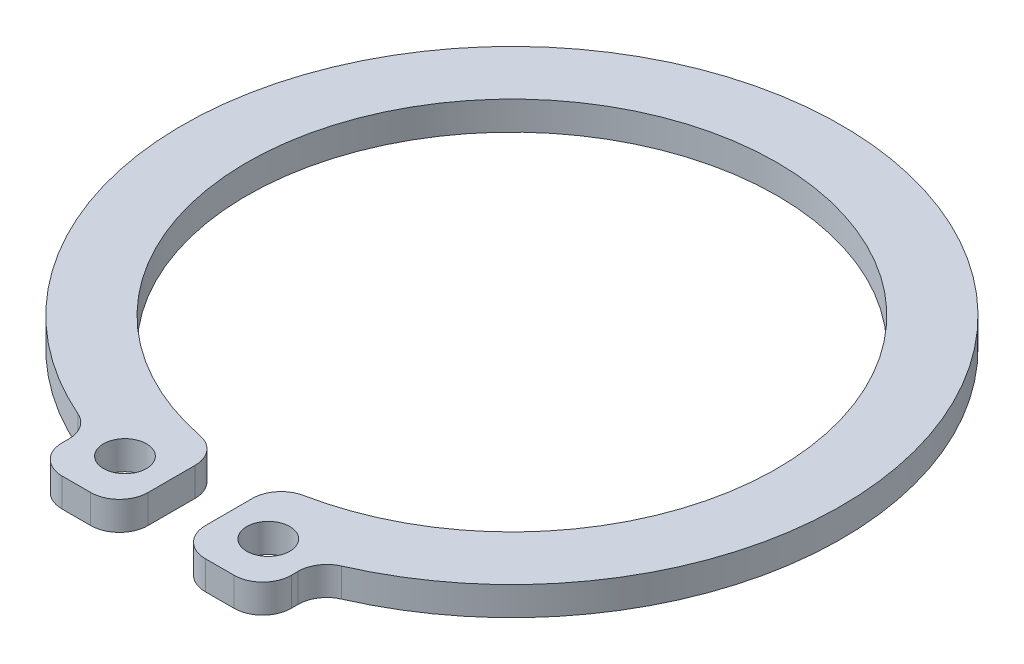
ISO-10303-21;
HEADER;
FILE_DESCRIPTION(('STEP AP214'),'2;1');
FILE_NAME('part.step','',(''),(''),'','','');
FILE_SCHEMA(('AUTOMOTIVE_DESIGN { 1 0 10303 214 1 1 1 1 }'));
ENDSEC;
DATA;
#1=APPLICATION_CONTEXT('core data for automotive mechanical design processes');
#2=APPLICATION_PROTOCOL_DEFINITION('international standard','automotive_design',2000,#1);
#3=PRODUCT_CONTEXT('',#1,'mechanical');
#4=PRODUCT('Part','Part','',(#3));
#5=PRODUCT_RELATED_PRODUCT_CATEGORY('part','',(#4));
#6=PRODUCT_DEFINITION_FORMATION('','',#4);
#7=PRODUCT_DEFINITION_CONTEXT('part definition',#1,'design');
#8=PRODUCT_DEFINITION('design','',#6,#7);
#9=PRODUCT_DEFINITION_SHAPE('','',#8);
#10=(LENGTH_UNIT() NAMED_UNIT(*) SI_UNIT(.MILLI.,.METRE.));
#11=(NAMED_UNIT(*) PLANE_ANGLE_UNIT() SI_UNIT($,.RADIAN.));
#12=(NAMED_UNIT(*) SI_UNIT($,.STERADIAN.) SOLID_ANGLE_UNIT());
#13=UNCERTAINTY_MEASURE_WITH_UNIT(LENGTH_MEASURE(1.E-05),#10,'distance_accuracy_value','');
#14=(GEOMETRIC_REPRESENTATION_CONTEXT(3) GLOBAL_UNCERTAINTY_ASSIGNED_CONTEXT((#13)) GLOBAL_UNIT_ASSIGNED_CONTEXT((#10,
#11,#12)) REPRESENTATION_CONTEXT('',''));
#15=CARTESIAN_POINT('',(0.,0.,0.));
#16=DIRECTION('',(0.,0.,1.));
#17=DIRECTION('',(1.,0.,0.));
#18=AXIS2_PLACEMENT_3D('',#15,#16,#17);
#19=CARTESIAN_POINT('',(0.,0.,0.));
#20=DIRECTION('',(0.,1.,0.));
#21=DIRECTION('',(1.,0.,0.));
#22=AXIS2_PLACEMENT_3D('',#19,#20,#21);
#23=PLANE('',#22);
#24=CARTESIAN_POINT('',(2.5,0.,11.));
#25=DIRECTION('',(0.,1.,0.));
#26=DIRECTION('',(0.,0.,1.));
#27=AXIS2_PLACEMENT_3D('',#24,#25,#26);
#28=CIRCLE('',#27,0.75);
#29=CARTESIAN_POINT('',(2.5,0.,11.75));
#30=VERTEX_POINT('',#29);
#31=EDGE_CURVE('E224',#30,#30,#28,.T.);
#32=ORIENTED_EDGE('',*,*,#31,.T.);
#33=EDGE_LOOP('',(#32));
#34=FACE_BOUND('',#33,.T.);
#35=CARTESIAN_POINT('',(-2.5,0.,11.));
#36=DIRECTION('',(0.,1.,0.));
#37=DIRECTION('',(0.,0.,1.));
#38=AXIS2_PLACEMENT_3D('',#35,#36,#37);
#39=CIRCLE('',#38,0.75);
#40=CARTESIAN_POINT('',(-2.5,0.,11.75));
#41=VERTEX_POINT('',#40);
#42=EDGE_CURVE('E756',#41,#41,#39,.T.);
#43=ORIENTED_EDGE('',*,*,#42,.T.);
#44=EDGE_LOOP('',(#43));
#45=FACE_BOUND('',#44,.T.);
#46=DIRECTION('',(0.,0.,-1.));
#47=VECTOR('',#46,1.);
#48=CARTESIAN_POINT('',(-1.,0.,0.));
#49=LINE('',#48,#47);
#50=CARTESIAN_POINT('',(-1.,0.,11.69578707887));
#51=VERTEX_POINT('',#50);
#52=CARTESIAN_POINT('',(-1.,0.,10.05298463144));
#53=VERTEX_POINT('',#52);
#54=EDGE_CURVE('E291',#51,#53,#49,.T.);
#55=ORIENTED_EDGE('',*,*,#54,.F.);
#56=CARTESIAN_POINT('',(-2.,0.,11.69578707887));
#57=DIRECTION('',(0.,1.,0.));
#58=DIRECTION('',(0.,0.,-1.));
#59=AXIS2_PLACEMENT_3D('',#56,#57,#58);
#60=CIRCLE('',#59,1.);
#61=CARTESIAN_POINT('',(-2.,0.,12.69578707887));
#62=VERTEX_POINT('',#61);
#63=EDGE_CURVE('E304',#62,#51,#60,.T.);
#64=ORIENTED_EDGE('',*,*,#63,.F.);
#65=DIRECTION('',(1.,0.,0.));
#66=VECTOR('',#65,1.);
#67=CARTESIAN_POINT('',(0.,0.,12.69578707887));
#68=LINE('',#67,#66);
#69=CARTESIAN_POINT('',(-3.,0.,12.69578707887));
#70=VERTEX_POINT('',#69);
#71=EDGE_CURVE('E314',#70,#62,#68,.T.);
#72=ORIENTED_EDGE('',*,*,#71,.F.);
#73=CARTESIAN_POINT('',(-3.,0.,11.69578707887));
#74=DIRECTION('',(0.,1.,0.));
#75=DIRECTION('',(0.,0.,-1.));
#76=AXIS2_PLACEMENT_3D('',#73,#74,#75);
#77=CIRCLE('',#76,1.);
#78=CARTESIAN_POINT('',(-4.,0.,11.69578707887));
#79=VERTEX_POINT('',#78);
#80=EDGE_CURVE('E246',#79,#70,#77,.T.);
#81=ORIENTED_EDGE('',*,*,#80,.F.);
#82=DIRECTION('',(0.,0.,1.));
#83=VECTOR('',#82,1.);
#84=CARTESIAN_POINT('',(-4.,0.,0.));
#85=LINE('',#84,#83);
#86=CARTESIAN_POINT('',(-4.,0.,11.45643923739));
#87=VERTEX_POINT('',#86);
#88=EDGE_CURVE('E211',#87,#79,#85,.T.);
#89=ORIENTED_EDGE('',*,*,#88,.F.);
#90=CARTESIAN_POINT('',(-5.,0.,11.45643923739));
#91=DIRECTION('',(0.,-1.,0.));
#92=DIRECTION('',(0.,0.,1.));
#93=AXIS2_PLACEMENT_3D('',#90,#91,#92);
#94=CIRCLE('',#93,1.);
#95=CARTESIAN_POINT('',(-4.5999999999999,0.,10.5399240983989));
#96=VERTEX_POINT('',#95);
#97=EDGE_CURVE('E213',#96,#87,#94,.T.);
#98=ORIENTED_EDGE('',*,*,#97,.F.);
#99=CARTESIAN_POINT('',(0.,0.,0.));
#100=DIRECTION('',(0.,1.,0.));
#101=DIRECTION('',(0.,0.,1.));
#102=AXIS2_PLACEMENT_3D('',#99,#100,#101);
#103=CIRCLE('',#102,11.5);
#104=CARTESIAN_POINT('',(4.59999999999982,0.,10.5399240983987));
#105=VERTEX_POINT('',#104);
#106=EDGE_CURVE('E328',#105,#96,#103,.T.);
#107=ORIENTED_EDGE('',*,*,#106,.F.);
#108=CARTESIAN_POINT('',(5.,0.,11.45643923739));
#109=DIRECTION('',(0.,1.,0.));
#110=DIRECTION('',(0.,0.,1.));
#111=AXIS2_PLACEMENT_3D('',#108,#109,#110);
#112=CIRCLE('',#111,1.);
#113=CARTESIAN_POINT('',(4.,0.,11.45643923739));
#114=VERTEX_POINT('',#113);
#115=EDGE_CURVE('E295',#105,#114,#112,.T.);
#116=ORIENTED_EDGE('',*,*,#115,.T.);
#117=DIRECTION('',(0.,0.,-1.));
#118=VECTOR('',#117,1.);
#119=CARTESIAN_POINT('',(4.,0.,12.69578707887));
#120=LINE('',#119,#118);
#121=CARTESIAN_POINT('',(4.,0.,11.69578707887));
#122=VERTEX_POINT('',#121);
#123=EDGE_CURVE('E310',#122,#114,#120,.T.);
#124=ORIENTED_EDGE('',*,*,#123,.F.);
#125=CARTESIAN_POINT('',(3.,0.,11.69578707887));
#126=DIRECTION('',(0.,1.,0.));
#127=DIRECTION('',(0.,0.,-1.));
#128=AXIS2_PLACEMENT_3D('',#125,#126,#127);
#129=CIRCLE('',#128,1.);
#130=CARTESIAN_POINT('',(3.,0.,12.69578707887));
#131=VERTEX_POINT('',#130);
#132=EDGE_CURVE('E346',#131,#122,#129,.T.);
#133=ORIENTED_EDGE('',*,*,#132,.F.);
#134=DIRECTION('',(1.,0.,0.));
#135=VECTOR('',#134,1.);
#136=CARTESIAN_POINT('',(1.,0.,12.69578707887));
#137=LINE('',#136,#135);
#138=CARTESIAN_POINT('',(2.,0.,12.69578707887));
#139=VERTEX_POINT('',#138);
#140=EDGE_CURVE('E181',#139,#131,#137,.T.);
#141=ORIENTED_EDGE('',*,*,#140,.F.);
#142=CARTESIAN_POINT('',(2.,0.,11.69578707887));
#143=DIRECTION('',(0.,1.,0.));
#144=DIRECTION('',(0.,0.,-1.));
#145=AXIS2_PLACEMENT_3D('',#142,#143,#144);
#146=CIRCLE('',#145,1.);
#147=CARTESIAN_POINT('',(1.,0.,11.69578707887));
#148=VERTEX_POINT('',#147);
#149=EDGE_CURVE('E180',#148,#139,#146,.T.);
#150=ORIENTED_EDGE('',*,*,#149,.F.);
#151=DIRECTION('',(0.,0.,1.));
#152=VECTOR('',#151,1.);
#153=CARTESIAN_POINT('',(1.,0.,9.195787078875));
#154=LINE('',#153,#152);
#155=CARTESIAN_POINT('',(1.,0.,10.05298463144));
#156=VERTEX_POINT('',#155);
#157=EDGE_CURVE('E176',#156,#148,#154,.T.);
#158=ORIENTED_EDGE('',*,*,#157,.F.);
#159=CARTESIAN_POINT('',(2.,0.,10.05298463144));
#160=DIRECTION('',(0.,1.,0.));
#161=DIRECTION('',(0.,0.,-1.));
#162=AXIS2_PLACEMENT_3D('',#159,#160,#161);
#163=CIRCLE('',#162,1.);
#164=CARTESIAN_POINT('',(1.8048780487803,0.,9.07220564300679));
#165=VERTEX_POINT('',#164);
#166=EDGE_CURVE('E20',#165,#156,#163,.T.);
#167=ORIENTED_EDGE('',*,*,#166,.F.);
#168=CARTESIAN_POINT('',(0.,0.,0.));
#169=DIRECTION('',(0.,1.,0.));
#170=DIRECTION('',(0.,0.,1.));
#171=AXIS2_PLACEMENT_3D('',#168,#169,#170);
#172=CIRCLE('',#171,9.25);
#173=CARTESIAN_POINT('',(-1.8048780487803,0.,9.07220564300679));
#174=VERTEX_POINT('',#173);
#175=EDGE_CURVE('E11',#165,#174,#172,.T.);
#176=ORIENTED_EDGE('',*,*,#175,.T.);
#177=CARTESIAN_POINT('',(-2.,0.,10.05298463144));
#178=DIRECTION('',(0.,1.,0.));
#179=DIRECTION('',(0.,0.,-1.));
#180=AXIS2_PLACEMENT_3D('',#177,#178,#179);
#181=CIRCLE('',#180,1.);
#182=EDGE_CURVE('E283',#53,#174,#181,.T.);
#183=ORIENTED_EDGE('',*,*,#182,.F.);
#184=EDGE_LOOP('',(#55,#64,#72,#81,#89,#98,#107,#116,#124,#133,#141,#150,#158,#167,#176,#183));
#185=FACE_BOUND('',#184,.T.);
#186=ADVANCED_FACE('F17',(#34,#45,#185),#23,.F.);
#187=CARTESIAN_POINT('',(0.,0.,0.));
#188=DIRECTION('',(0.,1.,0.));
#189=DIRECTION('',(0.,0.,1.));
#190=AXIS2_PLACEMENT_3D('',#187,#188,#189);
#191=CYLINDRICAL_SURFACE('',#190,9.25);
#192=ORIENTED_EDGE('',*,*,#175,.F.);
#193=DIRECTION('',(0.,-1.,0.));
#194=VECTOR('',#193,1.);
#195=CARTESIAN_POINT('',(1.80487804878011,2.3036,9.07220564300675));
#196=LINE('',#195,#194);
#197=CARTESIAN_POINT('',(1.8048780487803,1.,9.07220564300679));
#198=VERTEX_POINT('',#197);
#199=EDGE_CURVE('E355',#198,#165,#196,.T.);
#200=ORIENTED_EDGE('',*,*,#199,.F.);
#201=CARTESIAN_POINT('',(0.,1.,0.));
#202=DIRECTION('',(0.,-1.,0.));
#203=DIRECTION('',(0.,0.,1.));
#204=AXIS2_PLACEMENT_3D('',#201,#202,#203);
#205=CIRCLE('',#204,9.25);
#206=CARTESIAN_POINT('',(-1.8048780487803,1.,9.07220564300679));
#207=VERTEX_POINT('',#206);
#208=EDGE_CURVE('E206',#207,#198,#205,.T.);
#209=ORIENTED_EDGE('',*,*,#208,.F.);
#210=DIRECTION('',(0.,1.,0.));
#211=VECTOR('',#210,1.);
#212=CARTESIAN_POINT('',(-1.80487804878011,2.3036,9.07220564300675));
#213=LINE('',#212,#211);
#214=EDGE_CURVE('E274',#174,#207,#213,.T.);
#215=ORIENTED_EDGE('',*,*,#214,.F.);
#216=EDGE_LOOP('',(#192,#200,#209,#215));
#217=FACE_BOUND('',#216,.T.);
#218=ADVANCED_FACE('F397',(#217),#191,.F.);
#219=CARTESIAN_POINT('',(2.,2.3036,10.05298463144));
#220=DIRECTION('',(0.,-1.,0.));
#221=DIRECTION('',(0.,0.,-1.));
#222=AXIS2_PLACEMENT_3D('',#219,#220,#221);
#223=CYLINDRICAL_SURFACE('',#222,1.);
#224=DIRECTION('',(0.,-1.,0.));
#225=VECTOR('',#224,1.);
#226=CARTESIAN_POINT('',(1.,0.,10.05298463144));
#227=LINE('',#226,#225);
#228=CARTESIAN_POINT('',(1.,1.,10.05298463144));
#229=VERTEX_POINT('',#228);
#230=EDGE_CURVE('E333',#229,#156,#227,.T.);
#231=ORIENTED_EDGE('',*,*,#230,.F.);
#232=CARTESIAN_POINT('',(2.,1.,10.05298463144));
#233=DIRECTION('',(0.,1.,0.));
#234=DIRECTION('',(0.,0.,-1.));
#235=AXIS2_PLACEMENT_3D('',#232,#233,#234);
#236=CIRCLE('',#235,1.);
#237=EDGE_CURVE('E198',#198,#229,#236,.T.);
#238=ORIENTED_EDGE('',*,*,#237,.F.);
#239=ORIENTED_EDGE('',*,*,#199,.T.);
#240=ORIENTED_EDGE('',*,*,#166,.T.);
#241=EDGE_LOOP('',(#231,#238,#239,#240));
#242=FACE_BOUND('',#241,.T.);
#243=ADVANCED_FACE('F402',(#242),#223,.T.);
#244=CARTESIAN_POINT('',(1.,0.,9.195787078875));
#245=DIRECTION('',(-1.,0.,0.));
#246=DIRECTION('',(0.,0.,1.));
#247=AXIS2_PLACEMENT_3D('',#244,#245,#246);
#248=PLANE('',#247);
#249=ORIENTED_EDGE('',*,*,#157,.T.);
#250=DIRECTION('',(0.,-1.,0.));
#251=VECTOR('',#250,1.);
#252=CARTESIAN_POINT('',(1.,2.3036,11.69578707887));
#253=LINE('',#252,#251);
#254=CARTESIAN_POINT('',(1.,1.,11.69578707887));
#255=VERTEX_POINT('',#254);
#256=EDGE_CURVE('E169',#255,#148,#253,.T.);
#257=ORIENTED_EDGE('',*,*,#256,.F.);
#258=DIRECTION('',(0.,0.,1.));
#259=VECTOR('',#258,1.);
#260=CARTESIAN_POINT('',(1.,1.,0.));
#261=LINE('',#260,#259);
#262=EDGE_CURVE('E173',#229,#255,#261,.T.);
#263=ORIENTED_EDGE('',*,*,#262,.F.);
#264=ORIENTED_EDGE('',*,*,#230,.T.);
#265=EDGE_LOOP('',(#249,#257,#263,#264));
#266=FACE_BOUND('',#265,.T.);
#267=ADVANCED_FACE('F171',(#266),#248,.T.);
#268=CARTESIAN_POINT('',(2.,2.3036,11.69578707887));
#269=DIRECTION('',(0.,-1.,0.));
#270=DIRECTION('',(0.,0.,-1.));
#271=AXIS2_PLACEMENT_3D('',#268,#269,#270);
#272=CYLINDRICAL_SURFACE('',#271,1.);
#273=DIRECTION('',(0.,-1.,0.));
#274=VECTOR('',#273,1.);
#275=CARTESIAN_POINT('',(2.,0.,12.69578707887));
#276=LINE('',#275,#274);
#277=CARTESIAN_POINT('',(2.,1.,12.69578707887));
#278=VERTEX_POINT('',#277);
#279=EDGE_CURVE('E187',#278,#139,#276,.T.);
#280=ORIENTED_EDGE('',*,*,#279,.F.);
#281=CARTESIAN_POINT('',(2.,1.,11.69578707887));
#282=DIRECTION('',(0.,1.,0.));
#283=DIRECTION('',(0.,0.,-1.));
#284=AXIS2_PLACEMENT_3D('',#281,#282,#283);
#285=CIRCLE('',#284,1.);
#286=EDGE_CURVE('E184',#255,#278,#285,.T.);
#287=ORIENTED_EDGE('',*,*,#286,.F.);
#288=ORIENTED_EDGE('',*,*,#256,.T.);
#289=ORIENTED_EDGE('',*,*,#149,.T.);
#290=EDGE_LOOP('',(#280,#287,#288,#289));
#291=FACE_BOUND('',#290,.T.);
#292=ADVANCED_FACE('F185',(#291),#272,.T.);
#293=CARTESIAN_POINT('',(1.,0.,12.69578707887));
#294=DIRECTION('',(0.,0.,1.));
#295=DIRECTION('',(1.,0.,0.));
#296=AXIS2_PLACEMENT_3D('',#293,#294,#295);
#297=PLANE('',#296);
#298=DIRECTION('',(1.,0.,0.));
#299=VECTOR('',#298,1.);
#300=CARTESIAN_POINT('',(0.,1.,12.69578707887));
#301=LINE('',#300,#299);
#302=CARTESIAN_POINT('',(3.,1.,12.69578707887));
#303=VERTEX_POINT('',#302);
#304=EDGE_CURVE('E192',#278,#303,#301,.T.);
#305=ORIENTED_EDGE('',*,*,#304,.F.);
#306=ORIENTED_EDGE('',*,*,#279,.T.);
#307=ORIENTED_EDGE('',*,*,#140,.T.);
#308=DIRECTION('',(0.,-1.,0.));
#309=VECTOR('',#308,1.);
#310=CARTESIAN_POINT('',(3.,2.3036,12.69578707887));
#311=LINE('',#310,#309);
#312=EDGE_CURVE('E343',#303,#131,#311,.T.);
#313=ORIENTED_EDGE('',*,*,#312,.F.);
#314=EDGE_LOOP('',(#305,#306,#307,#313));
#315=FACE_BOUND('',#314,.T.);
#316=ADVANCED_FACE('F517',(#315),#297,.T.);
#317=CARTESIAN_POINT('',(3.,2.3036,11.69578707887));
#318=DIRECTION('',(0.,-1.,0.));
#319=DIRECTION('',(0.,0.,-1.));
#320=AXIS2_PLACEMENT_3D('',#317,#318,#319);
#321=CYLINDRICAL_SURFACE('',#320,1.);
#322=DIRECTION('',(0.,-1.,0.));
#323=VECTOR('',#322,1.);
#324=CARTESIAN_POINT('',(4.,0.,11.69578707887));
#325=LINE('',#324,#323);
#326=CARTESIAN_POINT('',(4.,1.,11.69578707887));
#327=VERTEX_POINT('',#326);
#328=EDGE_CURVE('E339',#327,#122,#325,.T.);
#329=ORIENTED_EDGE('',*,*,#328,.F.);
#330=CARTESIAN_POINT('',(3.,1.,11.69578707887));
#331=DIRECTION('',(0.,1.,0.));
#332=DIRECTION('',(0.,0.,-1.));
#333=AXIS2_PLACEMENT_3D('',#330,#331,#332);
#334=CIRCLE('',#333,1.);
#335=EDGE_CURVE('E223',#303,#327,#334,.T.);
#336=ORIENTED_EDGE('',*,*,#335,.F.);
#337=ORIENTED_EDGE('',*,*,#312,.T.);
#338=ORIENTED_EDGE('',*,*,#132,.T.);
#339=EDGE_LOOP('',(#329,#336,#337,#338));
#340=FACE_BOUND('',#339,.T.);
#341=ADVANCED_FACE('F374',(#340),#321,.T.);
#342=CARTESIAN_POINT('',(4.,0.,12.69578707887));
#343=DIRECTION('',(1.,0.,0.));
#344=DIRECTION('',(0.,1.,0.));
#345=AXIS2_PLACEMENT_3D('',#342,#343,#344);
#346=PLANE('',#345);
#347=ORIENTED_EDGE('',*,*,#123,.T.);
#348=DIRECTION('',(0.,1.,0.));
#349=VECTOR('',#348,1.);
#350=CARTESIAN_POINT('',(4.,-1.3036,11.45643923739));
#351=LINE('',#350,#349);
#352=CARTESIAN_POINT('',(4.,1.,11.45643923739));
#353=VERTEX_POINT('',#352);
#354=EDGE_CURVE('E299',#114,#353,#351,.T.);
#355=ORIENTED_EDGE('',*,*,#354,.T.);
#356=DIRECTION('',(0.,0.,-1.));
#357=VECTOR('',#356,1.);
#358=CARTESIAN_POINT('',(4.,1.,0.));
#359=LINE('',#358,#357);
#360=EDGE_CURVE('E218',#327,#353,#359,.T.);
#361=ORIENTED_EDGE('',*,*,#360,.F.);
#362=ORIENTED_EDGE('',*,*,#328,.T.);
#363=EDGE_LOOP('',(#347,#355,#361,#362));
#364=FACE_BOUND('',#363,.T.);
#365=ADVANCED_FACE('F368',(#364),#346,.T.);
#366=CARTESIAN_POINT('',(5.,-1.3036,11.45643923739));
#367=DIRECTION('',(0.,1.,0.));
#368=DIRECTION('',(0.,0.,1.));
#369=AXIS2_PLACEMENT_3D('',#366,#367,#368);
#370=CYLINDRICAL_SURFACE('',#369,1.);
#371=ORIENTED_EDGE('',*,*,#115,.F.);
#372=DIRECTION('',(0.,-1.,0.));
#373=VECTOR('',#372,1.);
#374=CARTESIAN_POINT('',(4.59999999999964,0.,10.5399240983986));
#375=LINE('',#374,#373);
#376=CARTESIAN_POINT('',(4.59999999999982,1.,10.5399240983987));
#377=VERTEX_POINT('',#376);
#378=EDGE_CURVE('E300',#377,#105,#375,.T.);
#379=ORIENTED_EDGE('',*,*,#378,.F.);
#380=CARTESIAN_POINT('',(5.,1.,11.45643923739));
#381=DIRECTION('',(0.,-1.,0.));
#382=DIRECTION('',(0.,0.,1.));
#383=AXIS2_PLACEMENT_3D('',#380,#381,#382);
#384=CIRCLE('',#383,1.);
#385=EDGE_CURVE('E222',#353,#377,#384,.T.);
#386=ORIENTED_EDGE('',*,*,#385,.F.);
#387=ORIENTED_EDGE('',*,*,#354,.F.);
#388=EDGE_LOOP('',(#371,#379,#386,#387));
#389=FACE_BOUND('',#388,.T.);
#390=ADVANCED_FACE('F373',(#389),#370,.F.);
#391=CARTESIAN_POINT('',(0.,0.,0.));
#392=DIRECTION('',(0.,1.,0.));
#393=DIRECTION('',(0.,0.,1.));
#394=AXIS2_PLACEMENT_3D('',#391,#392,#393);
#395=CYLINDRICAL_SURFACE('',#394,11.5);
#396=ORIENTED_EDGE('',*,*,#106,.T.);
#397=DIRECTION('',(0.,1.,0.));
#398=VECTOR('',#397,1.);
#399=CARTESIAN_POINT('',(-4.59999999999979,-1.3036,10.5399240983989));
#400=LINE('',#399,#398);
#401=CARTESIAN_POINT('',(-4.5999999999999,1.,10.5399240983989));
#402=VERTEX_POINT('',#401);
#403=EDGE_CURVE('E325',#96,#402,#400,.T.);
#404=ORIENTED_EDGE('',*,*,#403,.T.);
#405=CARTESIAN_POINT('',(0.,1.,0.));
#406=DIRECTION('',(0.,1.,0.));
#407=DIRECTION('',(0.,0.,1.));
#408=AXIS2_PLACEMENT_3D('',#405,#406,#407);
#409=CIRCLE('',#408,11.5);
#410=EDGE_CURVE('E250',#377,#402,#409,.T.);
#411=ORIENTED_EDGE('',*,*,#410,.F.);
#412=ORIENTED_EDGE('',*,*,#378,.T.);
#413=EDGE_LOOP('',(#396,#404,#411,#412));
#414=FACE_BOUND('',#413,.T.);
#415=ADVANCED_FACE('F416',(#414),#395,.T.);
#416=CARTESIAN_POINT('',(-5.,-1.3036,11.45643923739));
#417=DIRECTION('',(0.,1.,0.));
#418=DIRECTION('',(0.,0.,1.));
#419=AXIS2_PLACEMENT_3D('',#416,#417,#418);
#420=CYLINDRICAL_SURFACE('',#419,1.);
#421=ORIENTED_EDGE('',*,*,#97,.T.);
#422=DIRECTION('',(0.,-1.,0.));
#423=VECTOR('',#422,1.);
#424=CARTESIAN_POINT('',(-4.,0.,11.45643923739));
#425=LINE('',#424,#423);
#426=CARTESIAN_POINT('',(-4.,1.,11.45643923739));
#427=VERTEX_POINT('',#426);
#428=EDGE_CURVE('E214',#427,#87,#425,.T.);
#429=ORIENTED_EDGE('',*,*,#428,.F.);
#430=CARTESIAN_POINT('',(-5.,1.,11.45643923739));
#431=DIRECTION('',(0.,-1.,0.));
#432=DIRECTION('',(0.,0.,1.));
#433=AXIS2_PLACEMENT_3D('',#430,#431,#432);
#434=CIRCLE('',#433,1.);
#435=EDGE_CURVE('E254',#402,#427,#434,.T.);
#436=ORIENTED_EDGE('',*,*,#435,.F.);
#437=ORIENTED_EDGE('',*,*,#403,.F.);
#438=EDGE_LOOP('',(#421,#429,#436,#437));
#439=FACE_BOUND('',#438,.T.);
#440=ADVANCED_FACE('F410',(#439),#420,.F.);
#441=CARTESIAN_POINT('',(-4.,0.,10.78192932642));
#442=DIRECTION('',(-1.,0.,0.));
#443=DIRECTION('',(0.,0.,1.));
#444=AXIS2_PLACEMENT_3D('',#441,#442,#443);
#445=PLANE('',#444);
#446=DIRECTION('',(0.,-1.,0.));
#447=VECTOR('',#446,1.);
#448=CARTESIAN_POINT('',(-4.,2.3036,11.69578707887));
#449=LINE('',#448,#447);
#450=CARTESIAN_POINT('',(-4.,1.,11.69578707887));
#451=VERTEX_POINT('',#450);
#452=EDGE_CURVE('E317',#451,#79,#449,.T.);
#453=ORIENTED_EDGE('',*,*,#452,.F.);
#454=DIRECTION('',(0.,0.,1.));
#455=VECTOR('',#454,1.);
#456=CARTESIAN_POINT('',(-4.,1.,0.));
#457=LINE('',#456,#455);
#458=EDGE_CURVE('E258',#427,#451,#457,.T.);
#459=ORIENTED_EDGE('',*,*,#458,.F.);
#460=ORIENTED_EDGE('',*,*,#428,.T.);
#461=ORIENTED_EDGE('',*,*,#88,.T.);
#462=EDGE_LOOP('',(#453,#459,#460,#461));
#463=FACE_BOUND('',#462,.T.);
#464=ADVANCED_FACE('F415',(#463),#445,.T.);
#465=CARTESIAN_POINT('',(-3.,2.3036,11.69578707887));
#466=DIRECTION('',(0.,-1.,0.));
#467=DIRECTION('',(0.,0.,-1.));
#468=AXIS2_PLACEMENT_3D('',#465,#466,#467);
#469=CYLINDRICAL_SURFACE('',#468,1.);
#470=DIRECTION('',(0.,-1.,0.));
#471=VECTOR('',#470,1.);
#472=CARTESIAN_POINT('',(-3.,0.,12.69578707887));
#473=LINE('',#472,#471);
#474=CARTESIAN_POINT('',(-3.,1.,12.69578707887));
#475=VERTEX_POINT('',#474);
#476=EDGE_CURVE('E307',#475,#70,#473,.T.);
#477=ORIENTED_EDGE('',*,*,#476,.F.);
#478=CARTESIAN_POINT('',(-3.,1.,11.69578707887));
#479=DIRECTION('',(0.,1.,0.));
#480=DIRECTION('',(0.,0.,-1.));
#481=AXIS2_PLACEMENT_3D('',#478,#479,#480);
#482=CIRCLE('',#481,1.);
#483=EDGE_CURVE('E262',#451,#475,#482,.T.);
#484=ORIENTED_EDGE('',*,*,#483,.F.);
#485=ORIENTED_EDGE('',*,*,#452,.T.);
#486=ORIENTED_EDGE('',*,*,#80,.T.);
#487=EDGE_LOOP('',(#477,#484,#485,#486));
#488=FACE_BOUND('',#487,.T.);
#489=ADVANCED_FACE('F472',(#488),#469,.T.);
#490=CARTESIAN_POINT('',(-4.,0.,12.69578707887));
#491=DIRECTION('',(0.,0.,1.));
#492=DIRECTION('',(1.,0.,0.));
#493=AXIS2_PLACEMENT_3D('',#490,#491,#492);
#494=PLANE('',#493);
#495=DIRECTION('',(1.,0.,0.));
#496=VECTOR('',#495,1.);
#497=CARTESIAN_POINT('',(0.,1.,12.69578707887));
#498=LINE('',#497,#496);
#499=CARTESIAN_POINT('',(-2.,1.,12.69578707887));
#500=VERTEX_POINT('',#499);
#501=EDGE_CURVE('E266',#475,#500,#498,.T.);
#502=ORIENTED_EDGE('',*,*,#501,.F.);
#503=ORIENTED_EDGE('',*,*,#476,.T.);
#504=ORIENTED_EDGE('',*,*,#71,.T.);
#505=DIRECTION('',(0.,-1.,0.));
#506=VECTOR('',#505,1.);
#507=CARTESIAN_POINT('',(-2.,2.3036,12.69578707887));
#508=LINE('',#507,#506);
#509=EDGE_CURVE('E294',#500,#62,#508,.T.);
#510=ORIENTED_EDGE('',*,*,#509,.F.);
#511=EDGE_LOOP('',(#502,#503,#504,#510));
#512=FACE_BOUND('',#511,.T.);
#513=ADVANCED_FACE('F466',(#512),#494,.T.);
#514=CARTESIAN_POINT('',(-2.,2.3036,11.69578707887));
#515=DIRECTION('',(0.,-1.,0.));
#516=DIRECTION('',(0.,0.,-1.));
#517=AXIS2_PLACEMENT_3D('',#514,#515,#516);
#518=CYLINDRICAL_SURFACE('',#517,1.);
#519=DIRECTION('',(0.,-1.,0.));
#520=VECTOR('',#519,1.);
#521=CARTESIAN_POINT('',(-1.,0.,11.69578707887));
#522=LINE('',#521,#520);
#523=CARTESIAN_POINT('',(-1.,1.,11.69578707887));
#524=VERTEX_POINT('',#523);
#525=EDGE_CURVE('E287',#524,#51,#522,.T.);
#526=ORIENTED_EDGE('',*,*,#525,.F.);
#527=CARTESIAN_POINT('',(-2.,1.,11.69578707887));
#528=DIRECTION('',(0.,1.,0.));
#529=DIRECTION('',(0.,0.,-1.));
#530=AXIS2_PLACEMENT_3D('',#527,#528,#529);
#531=CIRCLE('',#530,1.);
#532=EDGE_CURVE('E270',#500,#524,#531,.T.);
#533=ORIENTED_EDGE('',*,*,#532,.F.);
#534=ORIENTED_EDGE('',*,*,#509,.T.);
#535=ORIENTED_EDGE('',*,*,#63,.T.);
#536=EDGE_LOOP('',(#526,#533,#534,#535));
#537=FACE_BOUND('',#536,.T.);
#538=ADVANCED_FACE('F471',(#537),#518,.T.);
#539=CARTESIAN_POINT('',(-1.,0.,12.69578707887));
#540=DIRECTION('',(1.,0.,0.));
#541=DIRECTION('',(0.,1.,0.));
#542=AXIS2_PLACEMENT_3D('',#539,#540,#541);
#543=PLANE('',#542);
#544=DIRECTION('',(0.,0.,-1.));
#545=VECTOR('',#544,1.);
#546=CARTESIAN_POINT('',(-1.,1.,0.));
#547=LINE('',#546,#545);
#548=CARTESIAN_POINT('',(-1.,1.,10.05298463144));
#549=VERTEX_POINT('',#548);
#550=EDGE_CURVE('E234',#524,#549,#547,.T.);
#551=ORIENTED_EDGE('',*,*,#550,.F.);
#552=ORIENTED_EDGE('',*,*,#525,.T.);
#553=ORIENTED_EDGE('',*,*,#54,.T.);
#554=DIRECTION('',(0.,-1.,0.));
#555=VECTOR('',#554,1.);
#556=CARTESIAN_POINT('',(-1.,2.3036,10.05298463144));
#557=LINE('',#556,#555);
#558=EDGE_CURVE('E279',#549,#53,#557,.T.);
#559=ORIENTED_EDGE('',*,*,#558,.F.);
#560=EDGE_LOOP('',(#551,#552,#553,#559));
#561=FACE_BOUND('',#560,.T.);
#562=ADVANCED_FACE('F449',(#561),#543,.T.);
#563=CARTESIAN_POINT('',(-2.,2.3036,10.05298463144));
#564=DIRECTION('',(0.,-1.,0.));
#565=DIRECTION('',(0.,0.,-1.));
#566=AXIS2_PLACEMENT_3D('',#563,#564,#565);
#567=CYLINDRICAL_SURFACE('',#566,1.);
#568=ORIENTED_EDGE('',*,*,#214,.T.);
#569=CARTESIAN_POINT('',(-2.,1.,10.05298463144));
#570=DIRECTION('',(0.,1.,0.));
#571=DIRECTION('',(0.,0.,-1.));
#572=AXIS2_PLACEMENT_3D('',#569,#570,#571);
#573=CIRCLE('',#572,1.);
#574=EDGE_CURVE('E217',#549,#207,#573,.T.);
#575=ORIENTED_EDGE('',*,*,#574,.F.);
#576=ORIENTED_EDGE('',*,*,#558,.T.);
#577=ORIENTED_EDGE('',*,*,#182,.T.);
#578=EDGE_LOOP('',(#568,#575,#576,#577));
#579=FACE_BOUND('',#578,.T.);
#580=ADVANCED_FACE('F438',(#579),#567,.T.);
#581=CARTESIAN_POINT('',(0.,1.,0.));
#582=DIRECTION('',(0.,1.,0.));
#583=DIRECTION('',(1.,0.,0.));
#584=AXIS2_PLACEMENT_3D('',#581,#582,#583);
#585=PLANE('',#584);
#586=CARTESIAN_POINT('',(2.5,1.,11.));
#587=DIRECTION('',(0.,-1.,0.));
#588=DIRECTION('',(0.,0.,1.));
#589=AXIS2_PLACEMENT_3D('',#586,#587,#588);
#590=CIRCLE('',#589,0.75);
#591=CARTESIAN_POINT('',(2.5,1.,11.75));
#592=VERTEX_POINT('',#591);
#593=EDGE_CURVE('E228',#592,#592,#590,.T.);
#594=ORIENTED_EDGE('',*,*,#593,.T.);
#595=EDGE_LOOP('',(#594));
#596=FACE_BOUND('',#595,.T.);
#597=CARTESIAN_POINT('',(-2.5,1.,11.));
#598=DIRECTION('',(0.,-1.,0.));
#599=DIRECTION('',(0.,0.,1.));
#600=AXIS2_PLACEMENT_3D('',#597,#598,#599);
#601=CIRCLE('',#600,0.75);
#602=CARTESIAN_POINT('',(-2.5,1.,11.75));
#603=VERTEX_POINT('',#602);
#604=EDGE_CURVE('E210',#603,#603,#601,.T.);
#605=ORIENTED_EDGE('',*,*,#604,.T.);
#606=EDGE_LOOP('',(#605));
#607=FACE_BOUND('',#606,.T.);
#608=ORIENTED_EDGE('',*,*,#550,.T.);
#609=ORIENTED_EDGE('',*,*,#574,.T.);
#610=ORIENTED_EDGE('',*,*,#208,.T.);
#611=ORIENTED_EDGE('',*,*,#237,.T.);
#612=ORIENTED_EDGE('',*,*,#262,.T.);
#613=ORIENTED_EDGE('',*,*,#286,.T.);
#614=ORIENTED_EDGE('',*,*,#304,.T.);
#615=ORIENTED_EDGE('',*,*,#335,.T.);
#616=ORIENTED_EDGE('',*,*,#360,.T.);
#617=ORIENTED_EDGE('',*,*,#385,.T.);
#618=ORIENTED_EDGE('',*,*,#410,.T.);
#619=ORIENTED_EDGE('',*,*,#435,.T.);
#620=ORIENTED_EDGE('',*,*,#458,.T.);
#621=ORIENTED_EDGE('',*,*,#483,.T.);
#622=ORIENTED_EDGE('',*,*,#501,.T.);
#623=ORIENTED_EDGE('',*,*,#532,.T.);
#624=EDGE_LOOP('',(#608,#609,#610,#611,#612,#613,#614,#615,#616,#617,#618,#619,#620,#621,#622,#623));
#625=FACE_BOUND('',#624,.T.);
#626=ADVANCED_FACE('F195',(#596,#607,#625),#585,.T.);
#627=CARTESIAN_POINT('',(2.5,0.,11.));
#628=DIRECTION('',(0.,1.,0.));
#629=DIRECTION('',(0.,0.,1.));
#630=AXIS2_PLACEMENT_3D('',#627,#628,#629);
#631=CYLINDRICAL_SURFACE('',#630,0.75);
#632=ORIENTED_EDGE('',*,*,#593,.F.);
#633=EDGE_LOOP('',(#632));
#634=FACE_BOUND('',#633,.T.);
#635=ORIENTED_EDGE('',*,*,#31,.F.);
#636=EDGE_LOOP('',(#635));
#637=FACE_BOUND('',#636,.T.);
#638=ADVANCED_FACE('F389',(#634,#637),#631,.F.);
#639=CARTESIAN_POINT('',(-2.5,0.,11.));
#640=DIRECTION('',(0.,1.,0.));
#641=DIRECTION('',(0.,0.,1.));
#642=AXIS2_PLACEMENT_3D('',#639,#640,#641);
#643=CYLINDRICAL_SURFACE('',#642,0.75);
#644=ORIENTED_EDGE('',*,*,#604,.F.);
#645=EDGE_LOOP('',(#644));
#646=FACE_BOUND('',#645,.T.);
#647=ORIENTED_EDGE('',*,*,#42,.F.);
#648=EDGE_LOOP('',(#647));
#649=FACE_BOUND('',#648,.T.);
#650=ADVANCED_FACE('F384',(#646,#649),#643,.F.);
#651=CLOSED_SHELL('',(#186,#218,#243,#267,#292,#316,#341,#365,#390,#415,#440,#464,#489,#513,
#538,#562,#580,#626,#638,#650));
#652=MANIFOLD_SOLID_BREP('B1',#651);
#653=ADVANCED_BREP_SHAPE_REPRESENTATION('',(#18,#652),#14);
#654=SHAPE_DEFINITION_REPRESENTATION(#9,#653);
ENDSEC;
END-ISO-10303-21;
